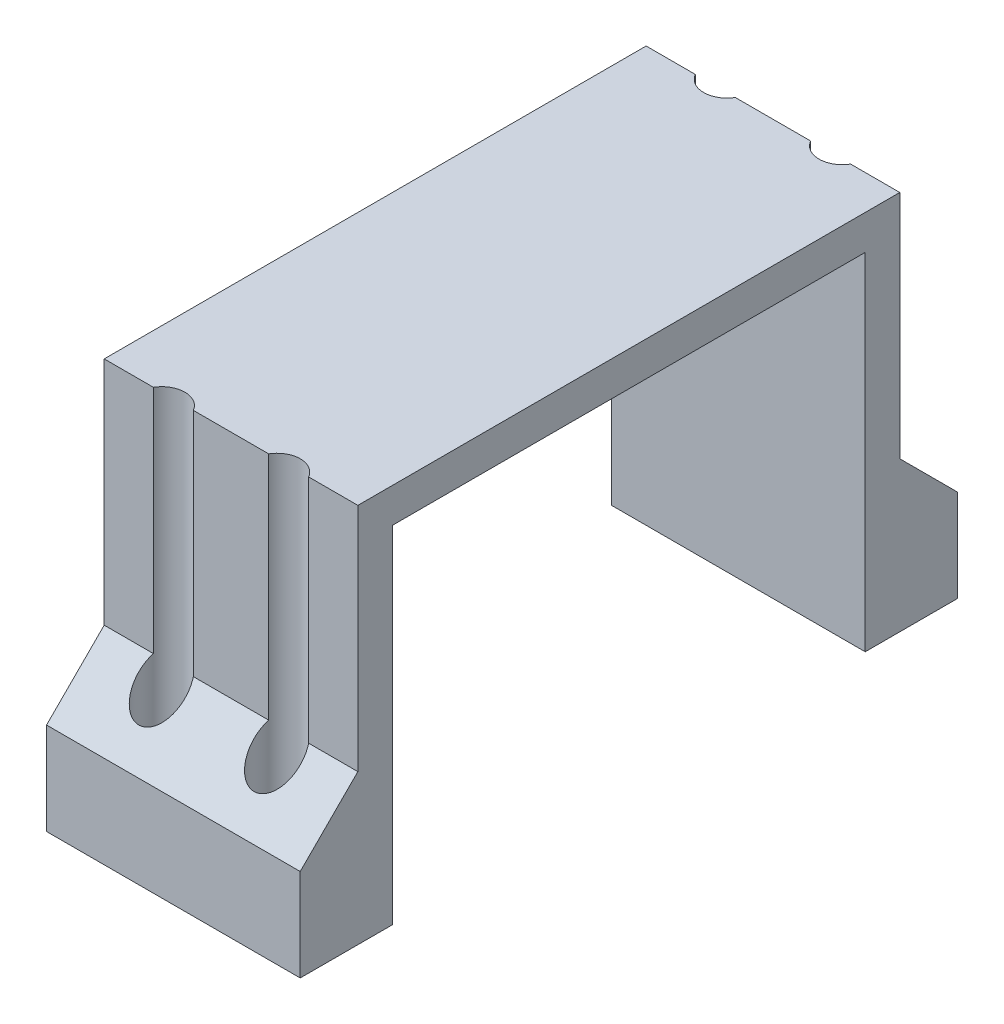
ISO-10303-21;
HEADER;
FILE_DESCRIPTION(('STEP AP214'),'2;1');
FILE_NAME('part.step','',(''),(''),'','','');
FILE_SCHEMA(('AUTOMOTIVE_DESIGN { 1 0 10303 214 1 1 1 1 }'));
ENDSEC;
DATA;
#1=APPLICATION_CONTEXT('core data for automotive mechanical design processes');
#2=APPLICATION_PROTOCOL_DEFINITION('international standard','automotive_design',2000,#1);
#3=PRODUCT_CONTEXT('',#1,'mechanical');
#4=PRODUCT('Part','Part','',(#3));
#5=PRODUCT_RELATED_PRODUCT_CATEGORY('part','',(#4));
#6=PRODUCT_DEFINITION_FORMATION('','',#4);
#7=PRODUCT_DEFINITION_CONTEXT('part definition',#1,'design');
#8=PRODUCT_DEFINITION('design','',#6,#7);
#9=PRODUCT_DEFINITION_SHAPE('','',#8);
#10=(LENGTH_UNIT() NAMED_UNIT(*) SI_UNIT(.MILLI.,.METRE.));
#11=(NAMED_UNIT(*) PLANE_ANGLE_UNIT() SI_UNIT($,.RADIAN.));
#12=(NAMED_UNIT(*) SI_UNIT($,.STERADIAN.) SOLID_ANGLE_UNIT());
#13=UNCERTAINTY_MEASURE_WITH_UNIT(LENGTH_MEASURE(1.E-05),#10,'distance_accuracy_value','');
#14=(GEOMETRIC_REPRESENTATION_CONTEXT(3) GLOBAL_UNCERTAINTY_ASSIGNED_CONTEXT((#13)) GLOBAL_UNIT_ASSIGNED_CONTEXT((#10,
#11,#12)) REPRESENTATION_CONTEXT('',''));
#15=CARTESIAN_POINT('',(0.,0.,0.));
#16=DIRECTION('',(0.,0.,1.));
#17=DIRECTION('',(1.,0.,0.));
#18=AXIS2_PLACEMENT_3D('',#15,#16,#17);
#19=CARTESIAN_POINT('',(-11.,3.,23.5));
#20=DIRECTION('',(0.,0.,-1.));
#21=DIRECTION('',(-1.,0.,0.));
#22=AXIS2_PLACEMENT_3D('',#19,#20,#21);
#23=PLANE('',#22);
#24=DIRECTION('',(0.,-1.,0.));
#25=VECTOR('',#24,1.);
#26=CARTESIAN_POINT('',(6.73205080756888,3.,23.5));
#27=LINE('',#26,#25);
#28=CARTESIAN_POINT('',(6.73205080756888,-17.,23.5));
#29=VERTEX_POINT('',#28);
#30=CARTESIAN_POINT('',(6.73205080756888,3.,23.5));
#31=VERTEX_POINT('',#30);
#32=EDGE_CURVE('E317',#29,#31,#27,.F.);
#33=ORIENTED_EDGE('',*,*,#32,.F.);
#34=DIRECTION('',(-1.,0.,0.));
#35=VECTOR('',#34,1.);
#36=CARTESIAN_POINT('',(11.,-17.,23.5));
#37=LINE('',#36,#35);
#38=CARTESIAN_POINT('',(11.,-17.,23.5));
#39=VERTEX_POINT('',#38);
#40=EDGE_CURVE('E291',#39,#29,#37,.T.);
#41=ORIENTED_EDGE('',*,*,#40,.F.);
#42=DIRECTION('',(0.,-1.,0.));
#43=VECTOR('',#42,1.);
#44=CARTESIAN_POINT('',(11.,3.,23.5));
#45=LINE('',#44,#43);
#46=CARTESIAN_POINT('',(11.,3.,23.5));
#47=VERTEX_POINT('',#46);
#48=EDGE_CURVE('E195',#47,#39,#45,.T.);
#49=ORIENTED_EDGE('',*,*,#48,.F.);
#50=DIRECTION('',(1.,0.,0.));
#51=VECTOR('',#50,1.);
#52=CARTESIAN_POINT('',(-11.,3.,23.5));
#53=LINE('',#52,#51);
#54=EDGE_CURVE('E198',#31,#47,#53,.T.);
#55=ORIENTED_EDGE('',*,*,#54,.F.);
#56=EDGE_LOOP('',(#33,#41,#49,#55));
#57=FACE_BOUND('',#56,.T.);
#58=ADVANCED_FACE('F39',(#57),#23,.F.);
#59=DIRECTION('',(0.,-1.,0.));
#60=VECTOR('',#59,1.);
#61=CARTESIAN_POINT('',(3.26794919243112,3.,23.5));
#62=LINE('',#61,#60);
#63=CARTESIAN_POINT('',(3.26794919243112,3.,23.5));
#64=VERTEX_POINT('',#63);
#65=CARTESIAN_POINT('',(3.26794919243112,-17.,23.5));
#66=VERTEX_POINT('',#65);
#67=EDGE_CURVE('E62',#64,#66,#62,.T.);
#68=ORIENTED_EDGE('',*,*,#67,.F.);
#69=CARTESIAN_POINT('',(-3.26794919243111,3.,23.5));
#70=VERTEX_POINT('',#69);
#71=EDGE_CURVE('E196',#70,#64,#53,.T.);
#72=ORIENTED_EDGE('',*,*,#71,.F.);
#73=DIRECTION('',(0.,-1.,0.));
#74=VECTOR('',#73,1.);
#75=CARTESIAN_POINT('',(-3.26794919243111,3.,23.5));
#76=LINE('',#75,#74);
#77=CARTESIAN_POINT('',(-3.26794919243111,-17.,23.5));
#78=VERTEX_POINT('',#77);
#79=EDGE_CURVE('E176',#78,#70,#76,.F.);
#80=ORIENTED_EDGE('',*,*,#79,.F.);
#81=EDGE_CURVE('E296',#66,#78,#37,.T.);
#82=ORIENTED_EDGE('',*,*,#81,.F.);
#83=EDGE_LOOP('',(#68,#72,#80,#82));
#84=FACE_BOUND('',#83,.T.);
#85=ADVANCED_FACE('F328',(#84),#23,.F.);
#86=DIRECTION('',(0.,-1.,0.));
#87=VECTOR('',#86,1.);
#88=CARTESIAN_POINT('',(-6.73205080756887,3.,23.5));
#89=LINE('',#88,#87);
#90=CARTESIAN_POINT('',(-6.73205080756887,3.,23.5));
#91=VERTEX_POINT('',#90);
#92=CARTESIAN_POINT('',(-6.73205080756886,-17.,23.5));
#93=VERTEX_POINT('',#92);
#94=EDGE_CURVE('E54',#91,#93,#89,.T.);
#95=ORIENTED_EDGE('',*,*,#94,.F.);
#96=CARTESIAN_POINT('',(-11.,3.,23.5));
#97=VERTEX_POINT('',#96);
#98=EDGE_CURVE('E188',#97,#91,#53,.T.);
#99=ORIENTED_EDGE('',*,*,#98,.F.);
#100=DIRECTION('',(0.,-1.,0.));
#101=VECTOR('',#100,1.);
#102=CARTESIAN_POINT('',(-11.,3.,23.5));
#103=LINE('',#102,#101);
#104=CARTESIAN_POINT('',(-11.,-17.,23.5));
#105=VERTEX_POINT('',#104);
#106=EDGE_CURVE('E200',#97,#105,#103,.T.);
#107=ORIENTED_EDGE('',*,*,#106,.T.);
#108=EDGE_CURVE('E189',#93,#105,#37,.T.);
#109=ORIENTED_EDGE('',*,*,#108,.F.);
#110=EDGE_LOOP('',(#95,#99,#107,#109));
#111=FACE_BOUND('',#110,.T.);
#112=ADVANCED_FACE('F186',(#111),#23,.F.);
#113=CARTESIAN_POINT('',(-11.,3.,-23.5));
#114=DIRECTION('',(0.,0.,1.));
#115=DIRECTION('',(1.,0.,0.));
#116=AXIS2_PLACEMENT_3D('',#113,#114,#115);
#117=PLANE('',#116);
#118=DIRECTION('',(-1.,0.,0.));
#119=VECTOR('',#118,1.);
#120=CARTESIAN_POINT('',(-11.,3.,-23.5));
#121=LINE('',#120,#119);
#122=CARTESIAN_POINT('',(3.26794919243112,3.,-23.5));
#123=VERTEX_POINT('',#122);
#124=CARTESIAN_POINT('',(-3.26794919243111,3.,-23.5));
#125=VERTEX_POINT('',#124);
#126=EDGE_CURVE('E210',#123,#125,#121,.T.);
#127=ORIENTED_EDGE('',*,*,#126,.F.);
#128=DIRECTION('',(0.,-1.,0.));
#129=VECTOR('',#128,1.);
#130=CARTESIAN_POINT('',(3.26794919243112,3.,-23.5));
#131=LINE('',#130,#129);
#132=CARTESIAN_POINT('',(3.26794919243112,-17.,-23.5));
#133=VERTEX_POINT('',#132);
#134=EDGE_CURVE('E272',#123,#133,#131,.T.);
#135=ORIENTED_EDGE('',*,*,#134,.T.);
#136=DIRECTION('',(-1.,0.,0.));
#137=VECTOR('',#136,1.);
#138=CARTESIAN_POINT('',(11.,-17.,-23.5));
#139=LINE('',#138,#137);
#140=CARTESIAN_POINT('',(-3.26794919243111,-17.,-23.5));
#141=VERTEX_POINT('',#140);
#142=EDGE_CURVE('E257',#133,#141,#139,.T.);
#143=ORIENTED_EDGE('',*,*,#142,.T.);
#144=DIRECTION('',(0.,-1.,0.));
#145=VECTOR('',#144,1.);
#146=CARTESIAN_POINT('',(-3.26794919243111,3.,-23.5));
#147=LINE('',#146,#145);
#148=EDGE_CURVE('E284',#141,#125,#147,.F.);
#149=ORIENTED_EDGE('',*,*,#148,.T.);
#150=EDGE_LOOP('',(#127,#135,#143,#149));
#151=FACE_BOUND('',#150,.T.);
#152=ADVANCED_FACE('F359',(#151),#117,.F.);
#153=CARTESIAN_POINT('',(-6.73205080756887,3.,-23.5));
#154=VERTEX_POINT('',#153);
#155=CARTESIAN_POINT('',(-11.,3.,-23.5));
#156=VERTEX_POINT('',#155);
#157=EDGE_CURVE('E212',#154,#156,#121,.T.);
#158=ORIENTED_EDGE('',*,*,#157,.F.);
#159=DIRECTION('',(0.,-1.,0.));
#160=VECTOR('',#159,1.);
#161=CARTESIAN_POINT('',(-6.73205080756887,3.,-23.5));
#162=LINE('',#161,#160);
#163=CARTESIAN_POINT('',(-6.73205080756886,-17.,-23.5));
#164=VERTEX_POINT('',#163);
#165=EDGE_CURVE('E281',#154,#164,#162,.T.);
#166=ORIENTED_EDGE('',*,*,#165,.T.);
#167=CARTESIAN_POINT('',(-11.,-17.,-23.5));
#168=VERTEX_POINT('',#167);
#169=EDGE_CURVE('E258',#164,#168,#139,.T.);
#170=ORIENTED_EDGE('',*,*,#169,.T.);
#171=DIRECTION('',(0.,-1.,0.));
#172=VECTOR('',#171,1.);
#173=CARTESIAN_POINT('',(-11.,3.,-23.5));
#174=LINE('',#173,#172);
#175=EDGE_CURVE('E334',#156,#168,#174,.T.);
#176=ORIENTED_EDGE('',*,*,#175,.F.);
#177=EDGE_LOOP('',(#158,#166,#170,#176));
#178=FACE_BOUND('',#177,.T.);
#179=ADVANCED_FACE('F364',(#178),#117,.F.);
#180=CARTESIAN_POINT('',(0.,0.,0.));
#181=DIRECTION('',(0.,1.,0.));
#182=DIRECTION('',(0.,0.,1.));
#183=AXIS2_PLACEMENT_3D('',#180,#181,#182);
#184=PLANE('',#183);
#185=DIRECTION('',(1.,0.,0.));
#186=VECTOR('',#185,1.);
#187=CARTESIAN_POINT('',(-11.,0.,20.5));
#188=LINE('',#187,#186);
#189=CARTESIAN_POINT('',(-11.,0.,20.5));
#190=VERTEX_POINT('',#189);
#191=CARTESIAN_POINT('',(11.,0.,20.5));
#192=VERTEX_POINT('',#191);
#193=EDGE_CURVE('E228',#190,#192,#188,.T.);
#194=ORIENTED_EDGE('',*,*,#193,.F.);
#195=DIRECTION('',(0.,0.,1.));
#196=VECTOR('',#195,1.);
#197=CARTESIAN_POINT('',(-11.,0.,-23.5));
#198=LINE('',#197,#196);
#199=CARTESIAN_POINT('',(-11.,0.,-20.5));
#200=VERTEX_POINT('',#199);
#201=EDGE_CURVE('E216',#200,#190,#198,.T.);
#202=ORIENTED_EDGE('',*,*,#201,.F.);
#203=DIRECTION('',(-1.,0.,0.));
#204=VECTOR('',#203,1.);
#205=CARTESIAN_POINT('',(-11.,0.,-20.5));
#206=LINE('',#205,#204);
#207=CARTESIAN_POINT('',(11.,0.,-20.5));
#208=VERTEX_POINT('',#207);
#209=EDGE_CURVE('E220',#208,#200,#206,.T.);
#210=ORIENTED_EDGE('',*,*,#209,.F.);
#211=DIRECTION('',(0.,0.,-1.));
#212=VECTOR('',#211,1.);
#213=CARTESIAN_POINT('',(11.,0.,-23.5));
#214=LINE('',#213,#212);
#215=EDGE_CURVE('E238',#192,#208,#214,.T.);
#216=ORIENTED_EDGE('',*,*,#215,.F.);
#217=EDGE_LOOP('',(#194,#202,#210,#216));
#218=FACE_BOUND('',#217,.T.);
#219=ADVANCED_FACE('F371',(#218),#184,.F.);
#220=CARTESIAN_POINT('',(11.,3.,-23.5));
#221=DIRECTION('',(-1.,0.,0.));
#222=DIRECTION('',(0.,0.,1.));
#223=AXIS2_PLACEMENT_3D('',#220,#221,#222);
#224=PLANE('',#223);
#225=ORIENTED_EDGE('',*,*,#48,.T.);
#226=DIRECTION('',(0.,0.707106781186546,-0.707106781186549));
#227=VECTOR('',#226,1.);
#228=CARTESIAN_POINT('',(11.,-22.,28.5));
#229=LINE('',#228,#227);
#230=CARTESIAN_POINT('',(11.,-22.,28.5));
#231=VERTEX_POINT('',#230);
#232=EDGE_CURVE('E305',#231,#39,#229,.T.);
#233=ORIENTED_EDGE('',*,*,#232,.F.);
#234=DIRECTION('',(0.,1.,0.));
#235=VECTOR('',#234,1.);
#236=CARTESIAN_POINT('',(11.,-30.,28.5));
#237=LINE('',#236,#235);
#238=CARTESIAN_POINT('',(11.,-30.,28.5));
#239=VERTEX_POINT('',#238);
#240=EDGE_CURVE('E302',#239,#231,#237,.T.);
#241=ORIENTED_EDGE('',*,*,#240,.F.);
#242=DIRECTION('',(0.,0.,1.));
#243=VECTOR('',#242,1.);
#244=CARTESIAN_POINT('',(11.,-30.,20.5));
#245=LINE('',#244,#243);
#246=CARTESIAN_POINT('',(11.,-30.,20.5));
#247=VERTEX_POINT('',#246);
#248=EDGE_CURVE('E242',#247,#239,#245,.T.);
#249=ORIENTED_EDGE('',*,*,#248,.F.);
#250=DIRECTION('',(0.,1.,0.));
#251=VECTOR('',#250,1.);
#252=CARTESIAN_POINT('',(11.,-30.,20.5));
#253=LINE('',#252,#251);
#254=EDGE_CURVE('E239',#247,#192,#253,.T.);
#255=ORIENTED_EDGE('',*,*,#254,.T.);
#256=ORIENTED_EDGE('',*,*,#215,.T.);
#257=DIRECTION('',(0.,1.,0.));
#258=VECTOR('',#257,1.);
#259=CARTESIAN_POINT('',(11.,-30.,-20.5));
#260=LINE('',#259,#258);
#261=CARTESIAN_POINT('',(11.,-30.,-20.5));
#262=VERTEX_POINT('',#261);
#263=EDGE_CURVE('E231',#262,#208,#260,.T.);
#264=ORIENTED_EDGE('',*,*,#263,.F.);
#265=DIRECTION('',(0.,0.,1.));
#266=VECTOR('',#265,1.);
#267=CARTESIAN_POINT('',(11.,-30.,-20.5));
#268=LINE('',#267,#266);
#269=CARTESIAN_POINT('',(11.,-30.,-28.5));
#270=VERTEX_POINT('',#269);
#271=EDGE_CURVE('E217',#270,#262,#268,.T.);
#272=ORIENTED_EDGE('',*,*,#271,.F.);
#273=DIRECTION('',(0.,1.,0.));
#274=VECTOR('',#273,1.);
#275=CARTESIAN_POINT('',(11.,-30.,-28.5));
#276=LINE('',#275,#274);
#277=CARTESIAN_POINT('',(11.,-22.,-28.5));
#278=VERTEX_POINT('',#277);
#279=EDGE_CURVE('E261',#270,#278,#276,.T.);
#280=ORIENTED_EDGE('',*,*,#279,.T.);
#281=DIRECTION('',(0.,0.707106781186546,0.707106781186549));
#282=VECTOR('',#281,1.);
#283=CARTESIAN_POINT('',(11.,-22.,-28.5));
#284=LINE('',#283,#282);
#285=CARTESIAN_POINT('',(11.,-17.,-23.5));
#286=VERTEX_POINT('',#285);
#287=EDGE_CURVE('E259',#278,#286,#284,.T.);
#288=ORIENTED_EDGE('',*,*,#287,.T.);
#289=DIRECTION('',(0.,-1.,0.));
#290=VECTOR('',#289,1.);
#291=CARTESIAN_POINT('',(11.,3.,-23.5));
#292=LINE('',#291,#290);
#293=CARTESIAN_POINT('',(11.,3.,-23.5));
#294=VERTEX_POINT('',#293);
#295=EDGE_CURVE('E382',#294,#286,#292,.T.);
#296=ORIENTED_EDGE('',*,*,#295,.F.);
#297=DIRECTION('',(0.,0.,-1.));
#298=VECTOR('',#297,1.);
#299=CARTESIAN_POINT('',(11.,3.,-23.5));
#300=LINE('',#299,#298);
#301=EDGE_CURVE('E214',#47,#294,#300,.T.);
#302=ORIENTED_EDGE('',*,*,#301,.F.);
#303=EDGE_LOOP('',(#225,#233,#241,#249,#255,#256,#264,#272,#280,#288,#296,#302));
#304=FACE_BOUND('',#303,.T.);
#305=ADVANCED_FACE('F41',(#304),#224,.F.);
#306=CARTESIAN_POINT('',(6.73205080756888,-17.,-23.5));
#307=VERTEX_POINT('',#306);
#308=EDGE_CURVE('E254',#286,#307,#139,.T.);
#309=ORIENTED_EDGE('',*,*,#308,.T.);
#310=DIRECTION('',(0.,-1.,0.));
#311=VECTOR('',#310,1.);
#312=CARTESIAN_POINT('',(6.73205080756888,3.,-23.5));
#313=LINE('',#312,#311);
#314=CARTESIAN_POINT('',(6.73205080756888,3.,-23.5));
#315=VERTEX_POINT('',#314);
#316=EDGE_CURVE('E275',#307,#315,#313,.F.);
#317=ORIENTED_EDGE('',*,*,#316,.T.);
#318=EDGE_CURVE('E208',#294,#315,#121,.T.);
#319=ORIENTED_EDGE('',*,*,#318,.F.);
#320=ORIENTED_EDGE('',*,*,#295,.T.);
#321=EDGE_LOOP('',(#309,#317,#319,#320));
#322=FACE_BOUND('',#321,.T.);
#323=ADVANCED_FACE('F366',(#322),#117,.F.);
#324=CARTESIAN_POINT('',(-11.,3.,-23.5));
#325=DIRECTION('',(1.,0.,0.));
#326=DIRECTION('',(0.,0.,-1.));
#327=AXIS2_PLACEMENT_3D('',#324,#325,#326);
#328=PLANE('',#327);
#329=ORIENTED_EDGE('',*,*,#175,.T.);
#330=DIRECTION('',(0.,0.707106781186546,0.707106781186549));
#331=VECTOR('',#330,1.);
#332=CARTESIAN_POINT('',(-11.,-22.,-28.5));
#333=LINE('',#332,#331);
#334=CARTESIAN_POINT('',(-11.,-22.,-28.5));
#335=VERTEX_POINT('',#334);
#336=EDGE_CURVE('E263',#335,#168,#333,.T.);
#337=ORIENTED_EDGE('',*,*,#336,.F.);
#338=DIRECTION('',(0.,1.,0.));
#339=VECTOR('',#338,1.);
#340=CARTESIAN_POINT('',(-11.,-30.,-28.5));
#341=LINE('',#340,#339);
#342=CARTESIAN_POINT('',(-11.,-30.,-28.5));
#343=VERTEX_POINT('',#342);
#344=EDGE_CURVE('E266',#343,#335,#341,.T.);
#345=ORIENTED_EDGE('',*,*,#344,.F.);
#346=DIRECTION('',(0.,0.,-1.));
#347=VECTOR('',#346,1.);
#348=CARTESIAN_POINT('',(-11.,-30.,-23.5));
#349=LINE('',#348,#347);
#350=CARTESIAN_POINT('',(-11.,-30.,-20.5));
#351=VERTEX_POINT('',#350);
#352=EDGE_CURVE('E223',#351,#343,#349,.T.);
#353=ORIENTED_EDGE('',*,*,#352,.F.);
#354=DIRECTION('',(0.,1.,0.));
#355=VECTOR('',#354,1.);
#356=CARTESIAN_POINT('',(-11.,-30.,-20.5));
#357=LINE('',#356,#355);
#358=EDGE_CURVE('E225',#351,#200,#357,.T.);
#359=ORIENTED_EDGE('',*,*,#358,.T.);
#360=ORIENTED_EDGE('',*,*,#201,.T.);
#361=DIRECTION('',(0.,1.,0.));
#362=VECTOR('',#361,1.);
#363=CARTESIAN_POINT('',(-11.,-30.,20.5));
#364=LINE('',#363,#362);
#365=CARTESIAN_POINT('',(-11.,-30.,20.5));
#366=VERTEX_POINT('',#365);
#367=EDGE_CURVE('E235',#366,#190,#364,.T.);
#368=ORIENTED_EDGE('',*,*,#367,.F.);
#369=DIRECTION('',(0.,0.,-1.));
#370=VECTOR('',#369,1.);
#371=CARTESIAN_POINT('',(-11.,-30.,23.5));
#372=LINE('',#371,#370);
#373=CARTESIAN_POINT('',(-11.,-30.,28.5));
#374=VERTEX_POINT('',#373);
#375=EDGE_CURVE('E245',#374,#366,#372,.T.);
#376=ORIENTED_EDGE('',*,*,#375,.F.);
#377=DIRECTION('',(0.,1.,0.));
#378=VECTOR('',#377,1.);
#379=CARTESIAN_POINT('',(-11.,-30.,28.5));
#380=LINE('',#379,#378);
#381=CARTESIAN_POINT('',(-11.,-22.,28.5));
#382=VERTEX_POINT('',#381);
#383=EDGE_CURVE('E308',#374,#382,#380,.T.);
#384=ORIENTED_EDGE('',*,*,#383,.T.);
#385=DIRECTION('',(0.,0.707106781186546,-0.707106781186549));
#386=VECTOR('',#385,1.);
#387=CARTESIAN_POINT('',(-11.,-22.,28.5));
#388=LINE('',#387,#386);
#389=EDGE_CURVE('E311',#382,#105,#388,.T.);
#390=ORIENTED_EDGE('',*,*,#389,.T.);
#391=ORIENTED_EDGE('',*,*,#106,.F.);
#392=DIRECTION('',(0.,0.,1.));
#393=VECTOR('',#392,1.);
#394=CARTESIAN_POINT('',(-11.,3.,-23.5));
#395=LINE('',#394,#393);
#396=EDGE_CURVE('E193',#156,#97,#395,.T.);
#397=ORIENTED_EDGE('',*,*,#396,.F.);
#398=EDGE_LOOP('',(#329,#337,#345,#353,#359,#360,#368,#376,#384,#390,#391,#397));
#399=FACE_BOUND('',#398,.T.);
#400=ADVANCED_FACE('F337',(#399),#328,.F.);
#401=CARTESIAN_POINT('',(0.,3.,0.));
#402=DIRECTION('',(0.,1.,0.));
#403=DIRECTION('',(0.,0.,1.));
#404=AXIS2_PLACEMENT_3D('',#401,#402,#403);
#405=PLANE('',#404);
#406=ORIENTED_EDGE('',*,*,#71,.T.);
#407=CARTESIAN_POINT('',(5.,3.,24.5));
#408=DIRECTION('',(0.,1.,0.));
#409=DIRECTION('',(0.,0.,1.));
#410=AXIS2_PLACEMENT_3D('',#407,#408,#409);
#411=CIRCLE('',#410,2.);
#412=EDGE_CURVE('E181',#31,#64,#411,.T.);
#413=ORIENTED_EDGE('',*,*,#412,.F.);
#414=ORIENTED_EDGE('',*,*,#54,.T.);
#415=ORIENTED_EDGE('',*,*,#301,.T.);
#416=ORIENTED_EDGE('',*,*,#318,.T.);
#417=CARTESIAN_POINT('',(5.,3.,-24.5));
#418=DIRECTION('',(0.,-1.,0.));
#419=DIRECTION('',(0.,0.,-1.));
#420=AXIS2_PLACEMENT_3D('',#417,#418,#419);
#421=CIRCLE('',#420,2.);
#422=EDGE_CURVE('E287',#315,#123,#421,.T.);
#423=ORIENTED_EDGE('',*,*,#422,.T.);
#424=ORIENTED_EDGE('',*,*,#126,.T.);
#425=CARTESIAN_POINT('',(-4.99999999999999,3.,-24.5));
#426=DIRECTION('',(0.,-1.,0.));
#427=DIRECTION('',(0.,0.,1.));
#428=AXIS2_PLACEMENT_3D('',#425,#426,#427);
#429=CIRCLE('',#428,2.);
#430=EDGE_CURVE('E288',#125,#154,#429,.T.);
#431=ORIENTED_EDGE('',*,*,#430,.T.);
#432=ORIENTED_EDGE('',*,*,#157,.T.);
#433=ORIENTED_EDGE('',*,*,#396,.T.);
#434=ORIENTED_EDGE('',*,*,#98,.T.);
#435=CARTESIAN_POINT('',(-4.99999999999999,3.,24.5));
#436=DIRECTION('',(0.,1.,0.));
#437=DIRECTION('',(0.,0.,-1.));
#438=AXIS2_PLACEMENT_3D('',#435,#436,#437);
#439=CIRCLE('',#438,2.);
#440=EDGE_CURVE('E173',#70,#91,#439,.T.);
#441=ORIENTED_EDGE('',*,*,#440,.F.);
#442=EDGE_LOOP('',(#406,#413,#414,#415,#416,#423,#424,#431,#432,#433,#434,#441));
#443=FACE_BOUND('',#442,.T.);
#444=ADVANCED_FACE('F191',(#443),#405,.T.);
#445=CARTESIAN_POINT('',(-11.,-30.,-20.5));
#446=DIRECTION('',(0.,0.,-1.));
#447=DIRECTION('',(-1.,0.,0.));
#448=AXIS2_PLACEMENT_3D('',#445,#446,#447);
#449=PLANE('',#448);
#450=ORIENTED_EDGE('',*,*,#209,.T.);
#451=ORIENTED_EDGE('',*,*,#358,.F.);
#452=DIRECTION('',(-1.,0.,0.));
#453=VECTOR('',#452,1.);
#454=CARTESIAN_POINT('',(-11.,-30.,-20.5));
#455=LINE('',#454,#453);
#456=EDGE_CURVE('E221',#262,#351,#455,.T.);
#457=ORIENTED_EDGE('',*,*,#456,.F.);
#458=ORIENTED_EDGE('',*,*,#263,.T.);
#459=EDGE_LOOP('',(#450,#451,#457,#458));
#460=FACE_BOUND('',#459,.T.);
#461=ADVANCED_FACE('F404',(#460),#449,.F.);
#462=CARTESIAN_POINT('',(0.,-30.,0.));
#463=DIRECTION('',(0.,1.,0.));
#464=DIRECTION('',(0.,0.,1.));
#465=AXIS2_PLACEMENT_3D('',#462,#463,#464);
#466=PLANE('',#465);
#467=CARTESIAN_POINT('',(5.,-30.,-24.5));
#468=DIRECTION('',(0.,1.,0.));
#469=DIRECTION('',(0.,0.,1.));
#470=AXIS2_PLACEMENT_3D('',#467,#468,#469);
#471=CIRCLE('',#470,2.);
#472=CARTESIAN_POINT('',(5.,-30.,-22.5));
#473=VERTEX_POINT('',#472);
#474=EDGE_CURVE('E269',#473,#473,#471,.T.);
#475=ORIENTED_EDGE('',*,*,#474,.T.);
#476=EDGE_LOOP('',(#475));
#477=FACE_BOUND('',#476,.T.);
#478=CARTESIAN_POINT('',(-4.99999999999999,-30.,-24.5));
#479=DIRECTION('',(0.,1.,0.));
#480=DIRECTION('',(0.,0.,1.));
#481=AXIS2_PLACEMENT_3D('',#478,#479,#480);
#482=CIRCLE('',#481,2.);
#483=CARTESIAN_POINT('',(-4.99999999999999,-30.,-22.5));
#484=VERTEX_POINT('',#483);
#485=EDGE_CURVE('E278',#484,#484,#482,.T.);
#486=ORIENTED_EDGE('',*,*,#485,.T.);
#487=EDGE_LOOP('',(#486));
#488=FACE_BOUND('',#487,.T.);
#489=ORIENTED_EDGE('',*,*,#271,.T.);
#490=ORIENTED_EDGE('',*,*,#456,.T.);
#491=ORIENTED_EDGE('',*,*,#352,.T.);
#492=DIRECTION('',(-1.,0.,0.));
#493=VECTOR('',#492,1.);
#494=CARTESIAN_POINT('',(11.,-30.,-28.5));
#495=LINE('',#494,#493);
#496=EDGE_CURVE('E234',#270,#343,#495,.T.);
#497=ORIENTED_EDGE('',*,*,#496,.F.);
#498=EDGE_LOOP('',(#489,#490,#491,#497));
#499=FACE_BOUND('',#498,.T.);
#500=ADVANCED_FACE('F409',(#477,#488,#499),#466,.F.);
#501=CARTESIAN_POINT('',(-11.,-30.,20.5));
#502=DIRECTION('',(0.,0.,1.));
#503=DIRECTION('',(1.,0.,0.));
#504=AXIS2_PLACEMENT_3D('',#501,#502,#503);
#505=PLANE('',#504);
#506=ORIENTED_EDGE('',*,*,#193,.T.);
#507=ORIENTED_EDGE('',*,*,#254,.F.);
#508=DIRECTION('',(1.,0.,0.));
#509=VECTOR('',#508,1.);
#510=CARTESIAN_POINT('',(-11.,-30.,20.5));
#511=LINE('',#510,#509);
#512=EDGE_CURVE('E247',#366,#247,#511,.T.);
#513=ORIENTED_EDGE('',*,*,#512,.F.);
#514=ORIENTED_EDGE('',*,*,#367,.T.);
#515=EDGE_LOOP('',(#506,#507,#513,#514));
#516=FACE_BOUND('',#515,.T.);
#517=ADVANCED_FACE('F429',(#516),#505,.F.);
#518=CARTESIAN_POINT('',(0.,-30.,0.));
#519=DIRECTION('',(0.,-1.,0.));
#520=DIRECTION('',(0.,0.,-1.));
#521=AXIS2_PLACEMENT_3D('',#518,#519,#520);
#522=PLANE('',#521);
#523=CARTESIAN_POINT('',(5.,-30.,24.5));
#524=DIRECTION('',(0.,-1.,0.));
#525=DIRECTION('',(0.,0.,-1.));
#526=AXIS2_PLACEMENT_3D('',#523,#524,#525);
#527=CIRCLE('',#526,2.);
#528=CARTESIAN_POINT('',(5.,-30.,22.5));
#529=VERTEX_POINT('',#528);
#530=EDGE_CURVE('E314',#529,#529,#527,.F.);
#531=ORIENTED_EDGE('',*,*,#530,.T.);
#532=EDGE_LOOP('',(#531));
#533=FACE_BOUND('',#532,.T.);
#534=CARTESIAN_POINT('',(-4.99999999999999,-30.,24.5));
#535=DIRECTION('',(0.,-1.,0.));
#536=DIRECTION('',(0.,0.,-1.));
#537=AXIS2_PLACEMENT_3D('',#534,#535,#536);
#538=CIRCLE('',#537,2.);
#539=CARTESIAN_POINT('',(-4.99999999999999,-30.,22.5));
#540=VERTEX_POINT('',#539);
#541=EDGE_CURVE('E320',#540,#540,#538,.F.);
#542=ORIENTED_EDGE('',*,*,#541,.T.);
#543=EDGE_LOOP('',(#542));
#544=FACE_BOUND('',#543,.T.);
#545=ORIENTED_EDGE('',*,*,#248,.T.);
#546=DIRECTION('',(-1.,0.,0.));
#547=VECTOR('',#546,1.);
#548=CARTESIAN_POINT('',(11.,-30.,28.5));
#549=LINE('',#548,#547);
#550=EDGE_CURVE('E299',#239,#374,#549,.T.);
#551=ORIENTED_EDGE('',*,*,#550,.T.);
#552=ORIENTED_EDGE('',*,*,#375,.T.);
#553=ORIENTED_EDGE('',*,*,#512,.T.);
#554=EDGE_LOOP('',(#545,#551,#552,#553));
#555=FACE_BOUND('',#554,.T.);
#556=ADVANCED_FACE('F436',(#533,#544,#555),#522,.T.);
#557=CARTESIAN_POINT('',(11.,-30.,-28.5));
#558=DIRECTION('',(0.,0.,1.));
#559=DIRECTION('',(1.,0.,0.));
#560=AXIS2_PLACEMENT_3D('',#557,#558,#559);
#561=PLANE('',#560);
#562=ORIENTED_EDGE('',*,*,#496,.T.);
#563=ORIENTED_EDGE('',*,*,#344,.T.);
#564=DIRECTION('',(-1.,0.,0.));
#565=VECTOR('',#564,1.);
#566=CARTESIAN_POINT('',(11.,-22.,-28.5));
#567=LINE('',#566,#565);
#568=EDGE_CURVE('E252',#278,#335,#567,.T.);
#569=ORIENTED_EDGE('',*,*,#568,.F.);
#570=ORIENTED_EDGE('',*,*,#279,.F.);
#571=EDGE_LOOP('',(#562,#563,#569,#570));
#572=FACE_BOUND('',#571,.T.);
#573=ADVANCED_FACE('F413',(#572),#561,.F.);
#574=CARTESIAN_POINT('',(11.,-22.,-28.5));
#575=DIRECTION('',(0.,-0.707106781186549,0.707106781186546));
#576=DIRECTION('',(0.,-0.707106781186546,-0.707106781186549));
#577=AXIS2_PLACEMENT_3D('',#574,#575,#576);
#578=PLANE('',#577);
#579=ORIENTED_EDGE('',*,*,#142,.F.);
#580=CARTESIAN_POINT('',(5.,-18.,-24.5));
#581=DIRECTION('',(0.,-0.707106781186549,0.707106781186546));
#582=DIRECTION('',(0.,-0.707106781186546,-0.707106781186549));
#583=AXIS2_PLACEMENT_3D('',#580,#581,#582);
#584=ELLIPSE('',#583,2.82842712474619,2.);
#585=EDGE_CURVE('E388',#133,#307,#584,.T.);
#586=ORIENTED_EDGE('',*,*,#585,.T.);
#587=ORIENTED_EDGE('',*,*,#308,.F.);
#588=ORIENTED_EDGE('',*,*,#287,.F.);
#589=ORIENTED_EDGE('',*,*,#568,.T.);
#590=ORIENTED_EDGE('',*,*,#336,.T.);
#591=ORIENTED_EDGE('',*,*,#169,.F.);
#592=CARTESIAN_POINT('',(-4.99999999999999,-18.,-24.5));
#593=DIRECTION('',(0.,-0.707106781186549,0.707106781186546));
#594=DIRECTION('',(0.,-0.707106781186546,-0.707106781186549));
#595=AXIS2_PLACEMENT_3D('',#592,#593,#594);
#596=ELLIPSE('',#595,2.82842712474619,2.);
#597=EDGE_CURVE('E392',#164,#141,#596,.T.);
#598=ORIENTED_EDGE('',*,*,#597,.T.);
#599=EDGE_LOOP('',(#579,#586,#587,#588,#589,#590,#591,#598));
#600=FACE_BOUND('',#599,.T.);
#601=ADVANCED_FACE('F387',(#600),#578,.F.);
#602=CARTESIAN_POINT('',(-4.99999999999999,3.,-24.5));
#603=DIRECTION('',(0.,-1.,0.));
#604=DIRECTION('',(0.,0.,-1.));
#605=AXIS2_PLACEMENT_3D('',#602,#603,#604);
#606=CYLINDRICAL_SURFACE('',#605,2.);
#607=ORIENTED_EDGE('',*,*,#430,.F.);
#608=ORIENTED_EDGE('',*,*,#148,.F.);
#609=ORIENTED_EDGE('',*,*,#597,.F.);
#610=ORIENTED_EDGE('',*,*,#165,.F.);
#611=EDGE_LOOP('',(#607,#608,#609,#610));
#612=FACE_BOUND('',#611,.T.);
#613=ORIENTED_EDGE('',*,*,#485,.F.);
#614=EDGE_LOOP('',(#613));
#615=FACE_BOUND('',#614,.T.);
#616=ADVANCED_FACE('F423',(#612,#615),#606,.F.);
#617=CARTESIAN_POINT('',(5.,3.,-24.5));
#618=DIRECTION('',(0.,-1.,0.));
#619=DIRECTION('',(0.,0.,-1.));
#620=AXIS2_PLACEMENT_3D('',#617,#618,#619);
#621=CYLINDRICAL_SURFACE('',#620,2.);
#622=ORIENTED_EDGE('',*,*,#422,.F.);
#623=ORIENTED_EDGE('',*,*,#316,.F.);
#624=ORIENTED_EDGE('',*,*,#585,.F.);
#625=ORIENTED_EDGE('',*,*,#134,.F.);
#626=EDGE_LOOP('',(#622,#623,#624,#625));
#627=FACE_BOUND('',#626,.T.);
#628=ORIENTED_EDGE('',*,*,#474,.F.);
#629=EDGE_LOOP('',(#628));
#630=FACE_BOUND('',#629,.T.);
#631=ADVANCED_FACE('F420',(#627,#630),#621,.F.);
#632=CARTESIAN_POINT('',(11.,-22.,28.5));
#633=DIRECTION('',(0.,0.707106781186549,0.707106781186546));
#634=DIRECTION('',(0.,-0.707106781186546,0.707106781186549));
#635=AXIS2_PLACEMENT_3D('',#632,#633,#634);
#636=PLANE('',#635);
#637=ORIENTED_EDGE('',*,*,#40,.T.);
#638=CARTESIAN_POINT('',(5.,-18.,24.5));
#639=DIRECTION('',(0.,0.707106781186549,0.707106781186546));
#640=DIRECTION('',(0.,-0.707106781186546,0.707106781186549));
#641=AXIS2_PLACEMENT_3D('',#638,#639,#640);
#642=ELLIPSE('',#641,2.82842712474619,2.);
#643=EDGE_CURVE('E11',#29,#66,#642,.F.);
#644=ORIENTED_EDGE('',*,*,#643,.T.);
#645=ORIENTED_EDGE('',*,*,#81,.T.);
#646=CARTESIAN_POINT('',(-4.99999999999999,-18.,24.5));
#647=DIRECTION('',(0.,0.707106781186549,0.707106781186546));
#648=DIRECTION('',(0.,-0.707106781186546,0.707106781186549));
#649=AXIS2_PLACEMENT_3D('',#646,#647,#648);
#650=ELLIPSE('',#649,2.82842712474619,2.);
#651=EDGE_CURVE('E47',#78,#93,#650,.F.);
#652=ORIENTED_EDGE('',*,*,#651,.T.);
#653=ORIENTED_EDGE('',*,*,#108,.T.);
#654=ORIENTED_EDGE('',*,*,#389,.F.);
#655=DIRECTION('',(-1.,0.,0.));
#656=VECTOR('',#655,1.);
#657=CARTESIAN_POINT('',(11.,-22.,28.5));
#658=LINE('',#657,#656);
#659=EDGE_CURVE('E297',#231,#382,#658,.T.);
#660=ORIENTED_EDGE('',*,*,#659,.F.);
#661=ORIENTED_EDGE('',*,*,#232,.T.);
#662=EDGE_LOOP('',(#637,#644,#645,#652,#653,#654,#660,#661));
#663=FACE_BOUND('',#662,.T.);
#664=ADVANCED_FACE('F332',(#663),#636,.T.);
#665=CARTESIAN_POINT('',(11.,-30.,28.5));
#666=DIRECTION('',(0.,0.,1.));
#667=DIRECTION('',(1.,0.,0.));
#668=AXIS2_PLACEMENT_3D('',#665,#666,#667);
#669=PLANE('',#668);
#670=ORIENTED_EDGE('',*,*,#659,.T.);
#671=ORIENTED_EDGE('',*,*,#383,.F.);
#672=ORIENTED_EDGE('',*,*,#550,.F.);
#673=ORIENTED_EDGE('',*,*,#240,.T.);
#674=EDGE_LOOP('',(#670,#671,#672,#673));
#675=FACE_BOUND('',#674,.T.);
#676=ADVANCED_FACE('F342',(#675),#669,.T.);
#677=CARTESIAN_POINT('',(-4.99999999999999,3.,24.5));
#678=DIRECTION('',(0.,-1.,0.));
#679=DIRECTION('',(0.,0.,-1.));
#680=AXIS2_PLACEMENT_3D('',#677,#678,#679);
#681=CYLINDRICAL_SURFACE('',#680,2.);
#682=ORIENTED_EDGE('',*,*,#541,.F.);
#683=EDGE_LOOP('',(#682));
#684=FACE_BOUND('',#683,.T.);
#685=ORIENTED_EDGE('',*,*,#79,.T.);
#686=ORIENTED_EDGE('',*,*,#440,.T.);
#687=ORIENTED_EDGE('',*,*,#94,.T.);
#688=ORIENTED_EDGE('',*,*,#651,.F.);
#689=EDGE_LOOP('',(#685,#686,#687,#688));
#690=FACE_BOUND('',#689,.T.);
#691=ADVANCED_FACE('F174',(#684,#690),#681,.F.);
#692=CARTESIAN_POINT('',(5.,3.,24.5));
#693=DIRECTION('',(0.,-1.,0.));
#694=DIRECTION('',(0.,0.,-1.));
#695=AXIS2_PLACEMENT_3D('',#692,#693,#694);
#696=CYLINDRICAL_SURFACE('',#695,2.);
#697=ORIENTED_EDGE('',*,*,#530,.F.);
#698=EDGE_LOOP('',(#697));
#699=FACE_BOUND('',#698,.T.);
#700=ORIENTED_EDGE('',*,*,#32,.T.);
#701=ORIENTED_EDGE('',*,*,#412,.T.);
#702=ORIENTED_EDGE('',*,*,#67,.T.);
#703=ORIENTED_EDGE('',*,*,#643,.F.);
#704=EDGE_LOOP('',(#700,#701,#702,#703));
#705=FACE_BOUND('',#704,.T.);
#706=ADVANCED_FACE('F324',(#699,#705),#696,.F.);
#707=CLOSED_SHELL('',(#58,#85,#112,#152,#179,#219,#305,#323,#400,#444,#461,#500,#517,#556,#573,
#601,#616,#631,#664,#676,#691,#706));
#708=MANIFOLD_SOLID_BREP('B2',#707);
#709=ADVANCED_BREP_SHAPE_REPRESENTATION('',(#18,#708),#14);
#710=SHAPE_DEFINITION_REPRESENTATION(#9,#709);
ENDSEC;
END-ISO-10303-21;
